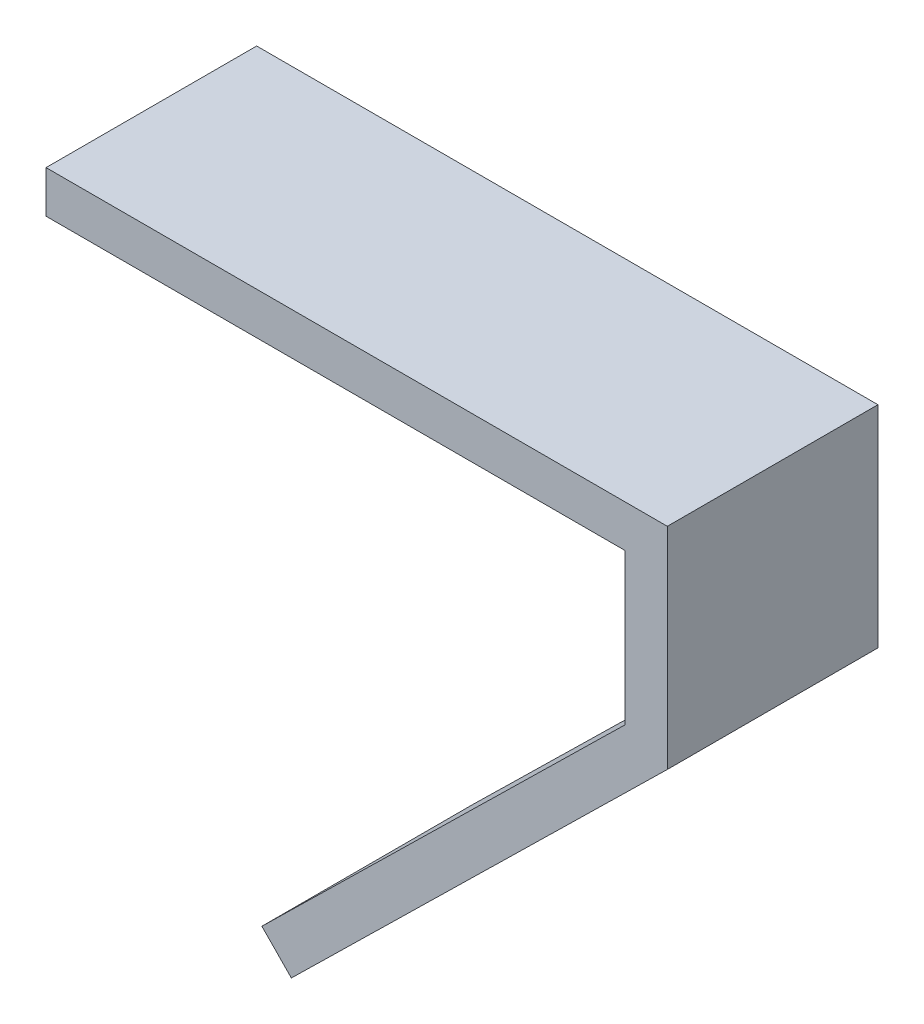
ISO-10303-21;
HEADER;
FILE_DESCRIPTION(('STEP AP214'),'2;1');
FILE_NAME('part.step','',(''),(''),'','','');
FILE_SCHEMA(('AUTOMOTIVE_DESIGN { 1 0 10303 214 1 1 1 1 }'));
ENDSEC;
DATA;
#1=APPLICATION_CONTEXT('core data for automotive mechanical design processes');
#2=APPLICATION_PROTOCOL_DEFINITION('international standard','automotive_design',2000,#1);
#3=PRODUCT_CONTEXT('',#1,'mechanical');
#4=PRODUCT('Part','Part','',(#3));
#5=PRODUCT_RELATED_PRODUCT_CATEGORY('part','',(#4));
#6=PRODUCT_DEFINITION_FORMATION('','',#4);
#7=PRODUCT_DEFINITION_CONTEXT('part definition',#1,'design');
#8=PRODUCT_DEFINITION('design','',#6,#7);
#9=PRODUCT_DEFINITION_SHAPE('','',#8);
#10=(LENGTH_UNIT() NAMED_UNIT(*) SI_UNIT(.MILLI.,.METRE.));
#11=(NAMED_UNIT(*) PLANE_ANGLE_UNIT() SI_UNIT($,.RADIAN.));
#12=(NAMED_UNIT(*) SI_UNIT($,.STERADIAN.) SOLID_ANGLE_UNIT());
#13=UNCERTAINTY_MEASURE_WITH_UNIT(LENGTH_MEASURE(1.E-05),#10,'distance_accuracy_value','');
#14=(GEOMETRIC_REPRESENTATION_CONTEXT(3) GLOBAL_UNCERTAINTY_ASSIGNED_CONTEXT((#13)) GLOBAL_UNIT_ASSIGNED_CONTEXT((#10,
#11,#12)) REPRESENTATION_CONTEXT('',''));
#15=CARTESIAN_POINT('',(0.,0.,0.));
#16=DIRECTION('',(0.,0.,1.));
#17=DIRECTION('',(1.,0.,0.));
#18=AXIS2_PLACEMENT_3D('',#15,#16,#17);
#19=CARTESIAN_POINT('',(102.156632840558,16.9578897546048,8.03470376394831));
#20=DIRECTION('',(-1.,0.,0.));
#21=DIRECTION('',(0.,0.,1.));
#22=AXIS2_PLACEMENT_3D('',#19,#20,#21);
#23=PLANE('',#22);
#24=DIRECTION('',(0.,-1.,0.));
#25=VECTOR('',#24,1.);
#26=CARTESIAN_POINT('',(102.156632840558,16.9578897546048,28.0347037639483));
#27=LINE('',#26,#25);
#28=CARTESIAN_POINT('',(102.156632840558,32.9578897546048,28.0347037639483));
#29=VERTEX_POINT('',#28);
#30=CARTESIAN_POINT('',(102.156632840558,18.6381028213771,28.0347037639483));
#31=VERTEX_POINT('',#30);
#32=EDGE_CURVE('E48',#29,#31,#27,.T.);
#33=ORIENTED_EDGE('',*,*,#32,.F.);
#34=DIRECTION('',(0.,0.,1.));
#35=VECTOR('',#34,1.);
#36=CARTESIAN_POINT('',(102.156632840558,32.9578897546048,8.03470376394831));
#37=LINE('',#36,#35);
#38=CARTESIAN_POINT('',(102.156632840558,32.9578897546048,8.03470376394831));
#39=VERTEX_POINT('',#38);
#40=EDGE_CURVE('E119',#39,#29,#37,.T.);
#41=ORIENTED_EDGE('',*,*,#40,.F.);
#42=DIRECTION('',(0.,-1.,0.));
#43=VECTOR('',#42,1.);
#44=CARTESIAN_POINT('',(102.156632840558,16.9578897546048,8.03470376394831));
#45=LINE('',#44,#43);
#46=CARTESIAN_POINT('',(102.156632840558,18.6381028213771,8.03470376394831));
#47=VERTEX_POINT('',#46);
#48=EDGE_CURVE('E56',#39,#47,#45,.T.);
#49=ORIENTED_EDGE('',*,*,#48,.T.);
#50=DIRECTION('',(0.,0.,-1.));
#51=VECTOR('',#50,1.);
#52=CARTESIAN_POINT('',(102.156632840558,18.6381028213771,0.));
#53=LINE('',#52,#51);
#54=EDGE_CURVE('E11',#31,#47,#53,.T.);
#55=ORIENTED_EDGE('',*,*,#54,.F.);
#56=EDGE_LOOP('',(#33,#41,#49,#55));
#57=FACE_BOUND('',#56,.T.);
#58=ADVANCED_FACE('F33',(#57),#23,.T.);
#59=CARTESIAN_POINT('',(103.356483474125,19.8143147099758,8.03470376394831));
#60=DIRECTION('',(0.,0.,1.));
#61=DIRECTION('',(1.,0.,0.));
#62=AXIS2_PLACEMENT_3D('',#59,#60,#61);
#63=PLANE('',#62);
#64=DIRECTION('',(0.,1.,0.));
#65=VECTOR('',#64,1.);
#66=CARTESIAN_POINT('',(106.156632840558,16.9578897546048,8.03470376394831));
#67=LINE('',#66,#65);
#68=CARTESIAN_POINT('',(106.156632840558,16.9578897546048,8.03470376394831));
#69=VERTEX_POINT('',#68);
#70=CARTESIAN_POINT('',(106.156632840558,36.9578897546048,8.03470376394831));
#71=VERTEX_POINT('',#70);
#72=EDGE_CURVE('E131',#69,#71,#67,.T.);
#73=ORIENTED_EDGE('',*,*,#72,.F.);
#74=DIRECTION('',(-0.714106238842749,-0.700037341608191,0.));
#75=VECTOR('',#74,1.);
#76=CARTESIAN_POINT('',(106.156632840558,16.9578897546048,8.03470376394831));
#77=LINE('',#76,#75);
#78=CARTESIAN_POINT('',(70.4513208984202,-18.0439773258048,8.03470376394831));
#79=VERTEX_POINT('',#78);
#80=EDGE_CURVE('E141',#69,#79,#77,.T.);
#81=ORIENTED_EDGE('',*,*,#80,.T.);
#82=DIRECTION('',(0.700037341608191,-0.714106238842749,0.));
#83=VECTOR('',#82,1.);
#84=CARTESIAN_POINT('',(67.6511715319874,-15.1875523704338,8.03470376394831));
#85=LINE('',#84,#83);
#86=CARTESIAN_POINT('',(67.6511715319874,-15.1875523704338,8.03470376394831));
#87=VERTEX_POINT('',#86);
#88=EDGE_CURVE('E41',#87,#79,#85,.T.);
#89=ORIENTED_EDGE('',*,*,#88,.F.);
#90=DIRECTION('',(-0.714106238842749,-0.700037341608191,0.));
#91=VECTOR('',#90,1.);
#92=CARTESIAN_POINT('',(103.356483474125,19.8143147099758,8.03470376394831));
#93=LINE('',#92,#91);
#94=EDGE_CURVE('E142',#47,#87,#93,.T.);
#95=ORIENTED_EDGE('',*,*,#94,.F.);
#96=ORIENTED_EDGE('',*,*,#48,.F.);
#97=DIRECTION('',(1.,0.,0.));
#98=VECTOR('',#97,1.);
#99=CARTESIAN_POINT('',(47.1566328405576,32.9578897546048,8.03470376394831));
#100=LINE('',#99,#98);
#101=CARTESIAN_POINT('',(47.1566328405576,32.9578897546048,8.03470376394831));
#102=VERTEX_POINT('',#101);
#103=EDGE_CURVE('E104',#102,#39,#100,.T.);
#104=ORIENTED_EDGE('',*,*,#103,.F.);
#105=DIRECTION('',(0.,-1.,0.));
#106=VECTOR('',#105,1.);
#107=CARTESIAN_POINT('',(47.1566328405576,36.9578897546048,8.03470376394831));
#108=LINE('',#107,#106);
#109=CARTESIAN_POINT('',(47.1566328405576,36.9578897546048,8.03470376394831));
#110=VERTEX_POINT('',#109);
#111=EDGE_CURVE('E110',#110,#102,#108,.T.);
#112=ORIENTED_EDGE('',*,*,#111,.F.);
#113=DIRECTION('',(-1.,0.,0.));
#114=VECTOR('',#113,1.);
#115=CARTESIAN_POINT('',(106.156632840558,36.9578897546048,8.03470376394831));
#116=LINE('',#115,#114);
#117=EDGE_CURVE('E134',#71,#110,#116,.T.);
#118=ORIENTED_EDGE('',*,*,#117,.F.);
#119=EDGE_LOOP('',(#73,#81,#89,#95,#96,#104,#112,#118));
#120=FACE_BOUND('',#119,.T.);
#121=ADVANCED_FACE('F35',(#120),#63,.F.);
#122=CARTESIAN_POINT('',(67.6511715319874,-15.1875523704338,28.0347037639483));
#123=DIRECTION('',(0.714106238842749,0.700037341608191,0.));
#124=DIRECTION('',(-0.700037341608191,0.714106238842749,0.));
#125=AXIS2_PLACEMENT_3D('',#122,#123,#124);
#126=PLANE('',#125);
#127=DIRECTION('',(0.,0.,1.));
#128=VECTOR('',#127,1.);
#129=CARTESIAN_POINT('',(70.4513208984202,-18.0439773258048,28.0347037639483));
#130=LINE('',#129,#128);
#131=CARTESIAN_POINT('',(70.4513208984202,-18.0439773258048,28.0347037639483));
#132=VERTEX_POINT('',#131);
#133=EDGE_CURVE('E152',#79,#132,#130,.T.);
#134=ORIENTED_EDGE('',*,*,#133,.T.);
#135=DIRECTION('',(0.700037341608191,-0.714106238842749,0.));
#136=VECTOR('',#135,1.);
#137=CARTESIAN_POINT('',(67.6511715319874,-15.1875523704338,28.0347037639483));
#138=LINE('',#137,#136);
#139=CARTESIAN_POINT('',(67.6511715319874,-15.1875523704338,28.0347037639483));
#140=VERTEX_POINT('',#139);
#141=EDGE_CURVE('E149',#140,#132,#138,.T.);
#142=ORIENTED_EDGE('',*,*,#141,.F.);
#143=DIRECTION('',(0.,0.,1.));
#144=VECTOR('',#143,1.);
#145=CARTESIAN_POINT('',(67.6511715319874,-15.1875523704338,28.0347037639483));
#146=LINE('',#145,#144);
#147=EDGE_CURVE('E144',#87,#140,#146,.T.);
#148=ORIENTED_EDGE('',*,*,#147,.F.);
#149=ORIENTED_EDGE('',*,*,#88,.T.);
#150=EDGE_LOOP('',(#134,#142,#148,#149));
#151=FACE_BOUND('',#150,.T.);
#152=ADVANCED_FACE('F163',(#151),#126,.F.);
#153=CARTESIAN_POINT('',(103.356483474125,19.8143147099758,28.0347037639483));
#154=DIRECTION('',(0.,0.,-1.));
#155=DIRECTION('',(-1.,0.,0.));
#156=AXIS2_PLACEMENT_3D('',#153,#154,#155);
#157=PLANE('',#156);
#158=DIRECTION('',(0.714106238842749,0.700037341608191,0.));
#159=VECTOR('',#158,1.);
#160=CARTESIAN_POINT('',(106.156632840558,16.9578897546048,28.0347037639483));
#161=LINE('',#160,#159);
#162=CARTESIAN_POINT('',(106.156632840558,16.9578897546048,28.0347037639483));
#163=VERTEX_POINT('',#162);
#164=EDGE_CURVE('E154',#132,#163,#161,.T.);
#165=ORIENTED_EDGE('',*,*,#164,.T.);
#166=DIRECTION('',(0.,1.,0.));
#167=VECTOR('',#166,1.);
#168=CARTESIAN_POINT('',(106.156632840558,16.9578897546048,28.0347037639483));
#169=LINE('',#168,#167);
#170=CARTESIAN_POINT('',(106.156632840558,36.9578897546048,28.0347037639483));
#171=VERTEX_POINT('',#170);
#172=EDGE_CURVE('E123',#163,#171,#169,.T.);
#173=ORIENTED_EDGE('',*,*,#172,.T.);
#174=DIRECTION('',(-1.,0.,0.));
#175=VECTOR('',#174,1.);
#176=CARTESIAN_POINT('',(106.156632840558,36.9578897546048,28.0347037639483));
#177=LINE('',#176,#175);
#178=CARTESIAN_POINT('',(47.1566328405576,36.9578897546048,28.0347037639483));
#179=VERTEX_POINT('',#178);
#180=EDGE_CURVE('E126',#171,#179,#177,.T.);
#181=ORIENTED_EDGE('',*,*,#180,.T.);
#182=DIRECTION('',(0.,1.,0.));
#183=VECTOR('',#182,1.);
#184=CARTESIAN_POINT('',(47.1566328405576,36.9578897546048,28.0347037639483));
#185=LINE('',#184,#183);
#186=CARTESIAN_POINT('',(47.1566328405576,32.9578897546048,28.0347037639483));
#187=VERTEX_POINT('',#186);
#188=EDGE_CURVE('E109',#187,#179,#185,.T.);
#189=ORIENTED_EDGE('',*,*,#188,.F.);
#190=DIRECTION('',(1.,0.,0.));
#191=VECTOR('',#190,1.);
#192=CARTESIAN_POINT('',(47.1566328405576,32.9578897546048,28.0347037639483));
#193=LINE('',#192,#191);
#194=EDGE_CURVE('E105',#187,#29,#193,.T.);
#195=ORIENTED_EDGE('',*,*,#194,.T.);
#196=ORIENTED_EDGE('',*,*,#32,.T.);
#197=DIRECTION('',(0.714106238842749,0.700037341608191,0.));
#198=VECTOR('',#197,1.);
#199=CARTESIAN_POINT('',(103.356483474125,19.8143147099758,28.0347037639483));
#200=LINE('',#199,#198);
#201=EDGE_CURVE('E147',#140,#31,#200,.T.);
#202=ORIENTED_EDGE('',*,*,#201,.F.);
#203=ORIENTED_EDGE('',*,*,#141,.T.);
#204=EDGE_LOOP('',(#165,#173,#181,#189,#195,#196,#202,#203));
#205=FACE_BOUND('',#204,.T.);
#206=ADVANCED_FACE('F173',(#205),#157,.F.);
#207=CARTESIAN_POINT('',(40.744883949677,-41.5637482459802,0.));
#208=DIRECTION('',(0.700037341608191,-0.714106238842749,0.));
#209=DIRECTION('',(0.714106238842749,0.700037341608191,0.));
#210=AXIS2_PLACEMENT_3D('',#207,#208,#209);
#211=PLANE('',#210);
#212=ORIENTED_EDGE('',*,*,#201,.T.);
#213=ORIENTED_EDGE('',*,*,#54,.T.);
#214=ORIENTED_EDGE('',*,*,#94,.T.);
#215=ORIENTED_EDGE('',*,*,#147,.T.);
#216=EDGE_LOOP('',(#212,#213,#214,#215));
#217=FACE_BOUND('',#216,.T.);
#218=ADVANCED_FACE('F175',(#217),#211,.F.);
#219=CARTESIAN_POINT('',(43.5450333161097,-44.4201732013512,0.));
#220=DIRECTION('',(0.700037341608191,-0.714106238842749,0.));
#221=DIRECTION('',(0.714106238842749,0.700037341608191,0.));
#222=AXIS2_PLACEMENT_3D('',#219,#220,#221);
#223=PLANE('',#222);
#224=ORIENTED_EDGE('',*,*,#80,.F.);
#225=DIRECTION('',(0.,0.,-1.));
#226=VECTOR('',#225,1.);
#227=CARTESIAN_POINT('',(106.156632840558,16.9578897546048,28.0347037639483));
#228=LINE('',#227,#226);
#229=EDGE_CURVE('E145',#163,#69,#228,.T.);
#230=ORIENTED_EDGE('',*,*,#229,.F.);
#231=ORIENTED_EDGE('',*,*,#164,.F.);
#232=ORIENTED_EDGE('',*,*,#133,.F.);
#233=EDGE_LOOP('',(#224,#230,#231,#232));
#234=FACE_BOUND('',#233,.T.);
#235=ADVANCED_FACE('F167',(#234),#223,.T.);
#236=CARTESIAN_POINT('',(106.156632840558,16.9578897546048,8.03470376394831));
#237=DIRECTION('',(1.,0.,0.));
#238=DIRECTION('',(0.,0.,-1.));
#239=AXIS2_PLACEMENT_3D('',#236,#237,#238);
#240=PLANE('',#239);
#241=ORIENTED_EDGE('',*,*,#172,.F.);
#242=ORIENTED_EDGE('',*,*,#229,.T.);
#243=ORIENTED_EDGE('',*,*,#72,.T.);
#244=DIRECTION('',(0.,0.,1.));
#245=VECTOR('',#244,1.);
#246=CARTESIAN_POINT('',(106.156632840558,36.9578897546048,8.03470376394831));
#247=LINE('',#246,#245);
#248=EDGE_CURVE('E136',#71,#171,#247,.T.);
#249=ORIENTED_EDGE('',*,*,#248,.T.);
#250=EDGE_LOOP('',(#241,#242,#243,#249));
#251=FACE_BOUND('',#250,.T.);
#252=ADVANCED_FACE('F171',(#251),#240,.T.);
#253=CARTESIAN_POINT('',(106.156632840558,36.9578897546048,8.03470376394831));
#254=DIRECTION('',(0.,1.,0.));
#255=DIRECTION('',(0.,0.,1.));
#256=AXIS2_PLACEMENT_3D('',#253,#254,#255);
#257=PLANE('',#256);
#258=ORIENTED_EDGE('',*,*,#180,.F.);
#259=ORIENTED_EDGE('',*,*,#248,.F.);
#260=ORIENTED_EDGE('',*,*,#117,.T.);
#261=DIRECTION('',(0.,0.,-1.));
#262=VECTOR('',#261,1.);
#263=CARTESIAN_POINT('',(47.1566328405576,36.9578897546048,8.03470376394831));
#264=LINE('',#263,#262);
#265=EDGE_CURVE('E116',#179,#110,#264,.T.);
#266=ORIENTED_EDGE('',*,*,#265,.F.);
#267=EDGE_LOOP('',(#258,#259,#260,#266));
#268=FACE_BOUND('',#267,.T.);
#269=ADVANCED_FACE('F179',(#268),#257,.T.);
#270=CARTESIAN_POINT('',(47.1566328405576,32.9578897546048,8.03470376394831));
#271=DIRECTION('',(0.,1.,0.));
#272=DIRECTION('',(0.,0.,1.));
#273=AXIS2_PLACEMENT_3D('',#270,#271,#272);
#274=PLANE('',#273);
#275=ORIENTED_EDGE('',*,*,#40,.T.);
#276=ORIENTED_EDGE('',*,*,#194,.F.);
#277=DIRECTION('',(0.,0.,1.));
#278=VECTOR('',#277,1.);
#279=CARTESIAN_POINT('',(47.1566328405576,32.9578897546048,8.03470376394831));
#280=LINE('',#279,#278);
#281=EDGE_CURVE('E100',#102,#187,#280,.T.);
#282=ORIENTED_EDGE('',*,*,#281,.F.);
#283=ORIENTED_EDGE('',*,*,#103,.T.);
#284=EDGE_LOOP('',(#275,#276,#282,#283));
#285=FACE_BOUND('',#284,.T.);
#286=ADVANCED_FACE('F102',(#285),#274,.F.);
#287=CARTESIAN_POINT('',(47.1566328405576,0.,0.));
#288=DIRECTION('',(-1.,0.,0.));
#289=DIRECTION('',(0.,0.,1.));
#290=AXIS2_PLACEMENT_3D('',#287,#288,#289);
#291=PLANE('',#290);
#292=ORIENTED_EDGE('',*,*,#111,.T.);
#293=ORIENTED_EDGE('',*,*,#281,.T.);
#294=ORIENTED_EDGE('',*,*,#188,.T.);
#295=ORIENTED_EDGE('',*,*,#265,.T.);
#296=EDGE_LOOP('',(#292,#293,#294,#295));
#297=FACE_BOUND('',#296,.T.);
#298=ADVANCED_FACE('F114',(#297),#291,.T.);
#299=CLOSED_SHELL('',(#58,#121,#152,#206,#218,#235,#252,#269,#286,#298));
#300=MANIFOLD_SOLID_BREP('B2',#299);
#301=ADVANCED_BREP_SHAPE_REPRESENTATION('',(#18,#300),#14);
#302=SHAPE_DEFINITION_REPRESENTATION(#9,#301);
ENDSEC;
END-ISO-10303-21;
